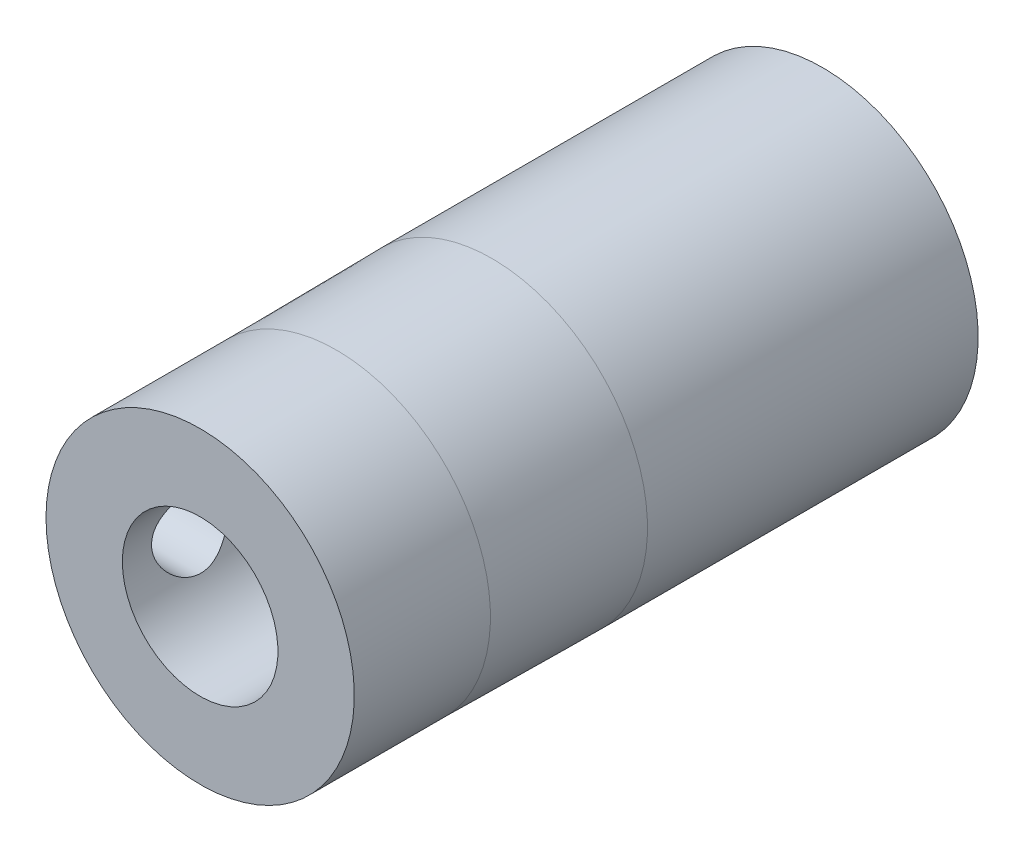
ISO-10303-21;
HEADER;
FILE_DESCRIPTION(('STEP AP214'),'2;1');
FILE_NAME('part.step','',(''),(''),'','','');
FILE_SCHEMA(('AUTOMOTIVE_DESIGN { 1 0 10303 214 1 1 1 1 }'));
ENDSEC;
DATA;
#1=APPLICATION_CONTEXT('core data for automotive mechanical design processes');
#2=APPLICATION_PROTOCOL_DEFINITION('international standard','automotive_design',2000,#1);
#3=PRODUCT_CONTEXT('',#1,'mechanical');
#4=PRODUCT('Part','Part','',(#3));
#5=PRODUCT_RELATED_PRODUCT_CATEGORY('part','',(#4));
#6=PRODUCT_DEFINITION_FORMATION('','',#4);
#7=PRODUCT_DEFINITION_CONTEXT('part definition',#1,'design');
#8=PRODUCT_DEFINITION('design','',#6,#7);
#9=PRODUCT_DEFINITION_SHAPE('','',#8);
#10=(LENGTH_UNIT() NAMED_UNIT(*) SI_UNIT(.MILLI.,.METRE.));
#11=(NAMED_UNIT(*) PLANE_ANGLE_UNIT() SI_UNIT($,.RADIAN.));
#12=(NAMED_UNIT(*) SI_UNIT($,.STERADIAN.) SOLID_ANGLE_UNIT());
#13=UNCERTAINTY_MEASURE_WITH_UNIT(LENGTH_MEASURE(1.E-05),#10,'distance_accuracy_value','');
#14=(GEOMETRIC_REPRESENTATION_CONTEXT(3) GLOBAL_UNCERTAINTY_ASSIGNED_CONTEXT((#13)) GLOBAL_UNIT_ASSIGNED_CONTEXT((#10,
#11,#12)) REPRESENTATION_CONTEXT('',''));
#15=CARTESIAN_POINT('',(0.,0.,0.));
#16=DIRECTION('',(0.,0.,1.));
#17=DIRECTION('',(1.,0.,0.));
#18=AXIS2_PLACEMENT_3D('',#15,#16,#17);
#19=CARTESIAN_POINT('',(0.,0.,-88.99));
#20=DIRECTION('',(0.,0.,-1.));
#21=DIRECTION('',(-1.,0.,0.));
#22=AXIS2_PLACEMENT_3D('',#19,#20,#21);
#23=CYLINDRICAL_SURFACE('',#22,4.);
#24=CARTESIAN_POINT('',(-4.,0.,-16.1741846858648));
#25=CARTESIAN_POINT('',(-3.99999426810082,0.105143925902467,-16.1741912904992));
#26=CARTESIAN_POINT('',(-3.99580982039513,0.210413199395125,-16.1825248321069));
#27=CARTESIAN_POINT('',(-3.97948312074314,0.417840470537793,-16.2154904465479));
#28=CARTESIAN_POINT('',(-3.96732575657839,0.519992173427259,-16.2401534718604));
#29=CARTESIAN_POINT('',(-3.93632558806751,0.717867089760898,-16.304572303098));
#30=CARTESIAN_POINT('',(-3.91750878355075,0.813613605878293,-16.3442694543607));
#31=CARTESIAN_POINT('',(-3.87491553031523,0.996945233613198,-16.4373259285947));
#32=CARTESIAN_POINT('',(-3.8511394726705,1.08453098798012,-16.4906841743625));
#33=CARTESIAN_POINT('',(-3.79912516516124,1.25501563552382,-16.6132191848353));
#34=CARTESIAN_POINT('',(-3.77070398255074,1.33731042224422,-16.683157644344));
#35=CARTESIAN_POINT('',(-3.71319940493486,1.48955888973396,-16.8352276443588));
#36=CARTESIAN_POINT('',(-3.68411552418069,1.55950316621354,-16.9173683894097));
#37=CARTESIAN_POINT('',(-3.62597902394695,1.69050400090056,-17.0991513849115));
#38=CARTESIAN_POINT('',(-3.59710373940264,1.75045067110328,-17.1996568825566));
#39=CARTESIAN_POINT('',(-3.54571957544641,1.85233645378139,-17.4109193578372));
#40=CARTESIAN_POINT('',(-3.52320615213979,1.89428842993267,-17.5216689433103));
#41=CARTESIAN_POINT('',(-3.48915734075617,1.95626488437718,-17.7435148967086));
#42=CARTESIAN_POINT('',(-3.47704543167427,1.97745171416089,-17.8541935899996));
#43=CARTESIAN_POINT('',(-3.46363779897055,2.00085398661769,-18.0781423614237));
#44=CARTESIAN_POINT('',(-3.46233138686576,2.00308817674615,-18.1914097676071));
#45=CARTESIAN_POINT('',(-3.47021860514497,1.98937457434459,-18.4027567344955));
#46=CARTESIAN_POINT('',(-3.47817527324027,1.97556911907365,-18.5010327483109));
#47=CARTESIAN_POINT('',(-3.501524574677,1.93387969811387,-18.6936285046109));
#48=CARTESIAN_POINT('',(-3.51691957663552,1.90599124779531,-18.7879469764754));
#49=CARTESIAN_POINT('',(-3.55374952825482,1.83641956077201,-18.9726429509961));
#50=CARTESIAN_POINT('',(-3.57531681327997,1.79443013423199,-19.0628774834364));
#51=CARTESIAN_POINT('',(-3.62206808562807,1.69808337533601,-19.2354532710448));
#52=CARTESIAN_POINT('',(-3.64725369560381,1.64372048762494,-19.317790957065));
#53=CARTESIAN_POINT('',(-3.70226315806571,1.51613210982558,-19.4832271913512));
#54=CARTESIAN_POINT('',(-3.73227020473492,1.44138891673857,-19.5650984330171));
#55=CARTESIAN_POINT('',(-3.79095246600814,1.27911115748275,-19.7156555230466));
#56=CARTESIAN_POINT('',(-3.81962703917602,1.19157051314857,-19.7843350699325));
#57=CARTESIAN_POINT('',(-3.87403974565928,1.0010330116637,-19.9095560079242));
#58=CARTESIAN_POINT('',(-3.89957968324014,0.897507183198821,-19.9653856307563));
#59=CARTESIAN_POINT('',(-3.94315762242485,0.680932430977596,-20.0583787439508));
#60=CARTESIAN_POINT('',(-3.96120157887106,0.567891152530555,-20.0955570558951));
#61=CARTESIAN_POINT('',(-3.98648667482871,0.345532983321407,-20.1471354932981));
#62=CARTESIAN_POINT('',(-3.9944987660262,0.236683061096655,-20.1631671573583));
#63=CARTESIAN_POINT('',(-4.00146026918207,0.0175591998987055,-20.1771141481338));
#64=CARTESIAN_POINT('',(-4.00041397442637,-0.0927140397398156,-20.1750380571437));
#65=CARTESIAN_POINT('',(-3.9898238450687,-0.302465943971972,-20.1537713090273));
#66=CARTESIAN_POINT('',(-3.98094491376337,-0.402118816099858,-20.1359196204048));
#67=CARTESIAN_POINT('',(-3.95644342629681,-0.596813784603881,-20.0857085420745));
#68=CARTESIAN_POINT('',(-3.94082012668824,-0.691855371382173,-20.0533475529578));
#69=CARTESIAN_POINT('',(-3.90368502827176,-0.877777216899145,-19.9741877529987));
#70=CARTESIAN_POINT('',(-3.88201763539262,-0.968460794011606,-19.9270025856322));
#71=CARTESIAN_POINT('',(-3.83487948634835,-1.14092272339854,-19.8199696145716));
#72=CARTESIAN_POINT('',(-3.80940711133877,-1.22269725955318,-19.760116416674));
#73=CARTESIAN_POINT('',(-3.75416442672396,-1.38353537857843,-19.6226638352033));
#74=CARTESIAN_POINT('',(-3.72421769686998,-1.46154415563805,-19.5438989489745));
#75=CARTESIAN_POINT('',(-3.6652478321764,-1.60371264223771,-19.3743343833093));
#76=CARTESIAN_POINT('',(-3.63622534800094,-1.66786277142375,-19.2835264481689));
#77=CARTESIAN_POINT('',(-3.58102384412979,-1.78341582895804,-19.0868973775188));
#78=CARTESIAN_POINT('',(-3.55505059178121,-1.8340509916005,-18.9805621536758));
#79=CARTESIAN_POINT('',(-3.51148144588269,-1.91616565186941,-18.7591645507148));
#80=CARTESIAN_POINT('',(-3.493874764435,-1.94766983173404,-18.644113632931));
#81=CARTESIAN_POINT('',(-3.47123002051604,-1.98772337493375,-18.4203642400954));
#82=CARTESIAN_POINT('',(-3.4651476693013,-1.99818599281091,-18.3121161789943));
#83=CARTESIAN_POINT('',(-3.46330709283206,-2.00137830875241,-18.0952905515357));
#84=CARTESIAN_POINT('',(-3.4675443925278,-1.99411569324649,-17.9867131483891));
#85=CARTESIAN_POINT('',(-3.48475724102153,-1.96385225118662,-17.7832176827979));
#86=CARTESIAN_POINT('',(-3.49686188965317,-1.94241662868607,-17.6879837455753));
#87=CARTESIAN_POINT('',(-3.52742032375305,-1.88635071644882,-17.502568447016));
#88=CARTESIAN_POINT('',(-3.54587615139337,-1.85171618231985,-17.4123887216807));
#89=CARTESIAN_POINT('',(-3.58857060729071,-1.76763149060113,-17.2329349838917));
#90=CARTESIAN_POINT('',(-3.61311444791841,-1.7173422756314,-17.1441288822067));
#91=CARTESIAN_POINT('',(-3.66470663269721,-1.60430194327479,-16.9756356135023));
#92=CARTESIAN_POINT('',(-3.69175627591221,-1.54154434248313,-16.8959532248226));
#93=CARTESIAN_POINT('',(-3.74924646316184,-1.39640665332275,-16.7379007211554));
#94=CARTESIAN_POINT('',(-3.77969966613256,-1.31256884599452,-16.6608664811642));
#95=CARTESIAN_POINT('',(-3.83755504519861,-1.1323096124664,-16.5216587189942));
#96=CARTESIAN_POINT('',(-3.8649555725239,-1.0358814466104,-16.459493206925));
#97=CARTESIAN_POINT('',(-3.91396019133075,-0.831863193565893,-16.3517119604406));
#98=CARTESIAN_POINT('',(-3.93552192987866,-0.724199007553462,-16.3062163473918));
#99=CARTESIAN_POINT('',(-3.97002682597974,-0.501484202276174,-16.23456835035));
#100=CARTESIAN_POINT('',(-3.98299446726136,-0.386455599178201,-16.2083609922533));
#101=CARTESIAN_POINT('',(-3.99390923826956,-0.225203892981792,-16.1863898636933));
#102=CARTESIAN_POINT('',(-3.99618730680502,-0.18032375888313,-16.1818194041321));
#103=CARTESIAN_POINT('',(-3.99923393953631,-0.0903034636101833,-16.1757153548366));
#104=CARTESIAN_POINT('',(-4.00000246206762,-0.0451632952932569,-16.1741818489244));
#105=CARTESIAN_POINT('',(-4.,0.,-16.1741846858648));
#106=B_SPLINE_CURVE_WITH_KNOTS('',3,(#24,#25,#26,#27,#28,#29,#30,#31,#32,#33,#34,#35,#36,#37,
#38,#39,#40,#41,#42,#43,#44,#45,#46,#47,#48,#49,#50,#51,#52,#53,#54,#55,#56,#57,#58,#59,#60,#61,
#62,#63,#64,#65,#66,#67,#68,#69,#70,#71,#72,#73,#74,#75,#76,#77,#78,#79,#80,#81,#82,#83,#84,#85,
#86,#87,#88,#89,#90,#91,#92,#93,#94,#95,#96,#97,#98,#99,#100,#101,#102,#103,#104,#105),
.UNSPECIFIED.,.T.,.F.,(4,2,2,2,2,2,2,2,2,2,2,2,2,2,2,2,2,2,2,2,2,2,2,2,2,2,2,2,2,2,2,2,2,2,2,2,
2,2,2,2,4),(0.,0.315248514840585,0.631096299418395,0.945724310984597,1.26032752116314,
1.59396351743618,1.92785247530807,2.28763452861506,2.64715895796562,2.9851602428046,
3.32282714658041,3.62011424818642,3.91749607851358,4.22180480336975,4.52625042520444,
4.86929882667758,5.21251069197373,5.57166044428882,5.9305243382456,6.25966580942692,
6.58865129022953,6.89213813012245,7.19565843261864,7.50785712055798,7.8201890149668,
8.16319221288839,8.50643177230864,8.86629364323453,9.22569023890903,9.55058615006095,
9.87534119729358,10.1691586049771,10.463070575767,10.7767291356058,11.0905512228726,
11.4425048551434,11.7946476676249,12.1492802732706,12.502898172423,12.6383056026784,
12.7737167702213),.UNSPECIFIED.);
#107=CARTESIAN_POINT('',(-4.,0.,-16.1741846858648));
#108=VERTEX_POINT('',#107);
#109=EDGE_CURVE('E74',#108,#108,#106,.T.);
#110=ORIENTED_EDGE('',*,*,#109,.T.);
#111=EDGE_LOOP('',(#110));
#112=FACE_BOUND('',#111,.T.);
#113=CARTESIAN_POINT('',(0.,0.,-14.6741846858648));
#114=DIRECTION('',(0.,0.,-1.));
#115=DIRECTION('',(-1.,0.,0.));
#116=AXIS2_PLACEMENT_3D('',#113,#114,#115);
#117=CIRCLE('',#116,4.);
#118=CARTESIAN_POINT('',(-4.,0.,-14.6741846858648));
#119=VERTEX_POINT('',#118);
#120=EDGE_CURVE('E70',#119,#119,#117,.T.);
#121=ORIENTED_EDGE('',*,*,#120,.F.);
#122=EDGE_LOOP('',(#121));
#123=FACE_BOUND('',#122,.T.);
#124=CARTESIAN_POINT('',(0.,0.,-46.6741846858648));
#125=DIRECTION('',(0.,0.,-1.));
#126=DIRECTION('',(-1.,0.,0.));
#127=AXIS2_PLACEMENT_3D('',#124,#125,#126);
#128=CIRCLE('',#127,4.);
#129=CARTESIAN_POINT('',(-4.,0.,-46.6741846858648));
#130=VERTEX_POINT('',#129);
#131=EDGE_CURVE('E10',#130,#130,#128,.T.);
#132=ORIENTED_EDGE('',*,*,#131,.T.);
#133=EDGE_LOOP('',(#132));
#134=FACE_BOUND('',#133,.T.);
#135=ADVANCED_FACE('F37',(#112,#123,#134),#23,.F.);
#136=CARTESIAN_POINT('',(4.,0.,-46.6741846858648));
#137=DIRECTION('',(0.,0.,1.));
#138=DIRECTION('',(1.,0.,0.));
#139=AXIS2_PLACEMENT_3D('',#136,#137,#138);
#140=PLANE('',#139);
#141=ORIENTED_EDGE('',*,*,#131,.F.);
#142=EDGE_LOOP('',(#141));
#143=FACE_BOUND('',#142,.T.);
#144=CARTESIAN_POINT('',(0.,0.,-46.6741846858648));
#145=DIRECTION('',(0.,0.,-1.));
#146=DIRECTION('',(-1.,0.,0.));
#147=AXIS2_PLACEMENT_3D('',#144,#145,#146);
#148=CIRCLE('',#147,8.);
#149=CARTESIAN_POINT('',(-8.,0.,-46.6741846858648));
#150=VERTEX_POINT('',#149);
#151=EDGE_CURVE('E51',#150,#150,#148,.T.);
#152=ORIENTED_EDGE('',*,*,#151,.T.);
#153=EDGE_LOOP('',(#152));
#154=FACE_BOUND('',#153,.T.);
#155=ADVANCED_FACE('F100',(#143,#154),#140,.F.);
#156=CARTESIAN_POINT('',(0.,0.,-88.99));
#157=DIRECTION('',(0.,0.,-1.));
#158=DIRECTION('',(-1.,0.,0.));
#159=AXIS2_PLACEMENT_3D('',#156,#157,#158);
#160=CYLINDRICAL_SURFACE('',#159,8.);
#161=ORIENTED_EDGE('',*,*,#151,.F.);
#162=EDGE_LOOP('',(#161));
#163=FACE_BOUND('',#162,.T.);
#164=CARTESIAN_POINT('',(0.,0.,-29.6741846858648));
#165=DIRECTION('',(0.,0.,-1.));
#166=DIRECTION('',(-1.,0.,0.));
#167=AXIS2_PLACEMENT_3D('',#164,#165,#166);
#168=CIRCLE('',#167,8.);
#169=CARTESIAN_POINT('',(-8.,0.,-29.6741846858648));
#170=VERTEX_POINT('',#169);
#171=EDGE_CURVE('E56',#170,#170,#168,.T.);
#172=ORIENTED_EDGE('',*,*,#171,.T.);
#173=EDGE_LOOP('',(#172));
#174=FACE_BOUND('',#173,.T.);
#175=ADVANCED_FACE('F97',(#163,#174),#160,.T.);
#176=CARTESIAN_POINT('',(0.,0.,-21.6741846858648));
#177=DIRECTION('',(0.,0.,-1.));
#178=DIRECTION('',(-1.,0.,0.));
#179=AXIS2_PLACEMENT_3D('',#176,#177,#178);
#180=CONICAL_SURFACE('',#179,7.925,0.00937472535628038);
#181=ORIENTED_EDGE('',*,*,#171,.F.);
#182=EDGE_LOOP('',(#181));
#183=FACE_BOUND('',#182,.T.);
#184=CARTESIAN_POINT('',(0.,0.,-21.6741846858648));
#185=DIRECTION('',(0.,0.,-1.));
#186=DIRECTION('',(-1.,0.,0.));
#187=AXIS2_PLACEMENT_3D('',#184,#185,#186);
#188=CIRCLE('',#187,7.925);
#189=CARTESIAN_POINT('',(-7.925,0.,-21.6741846858648));
#190=VERTEX_POINT('',#189);
#191=EDGE_CURVE('E62',#190,#190,#188,.T.);
#192=ORIENTED_EDGE('',*,*,#191,.T.);
#193=EDGE_LOOP('',(#192));
#194=FACE_BOUND('',#193,.T.);
#195=ADVANCED_FACE('F93',(#183,#194),#180,.T.);
#196=CARTESIAN_POINT('',(0.,0.,-88.99));
#197=DIRECTION('',(0.,0.,-1.));
#198=DIRECTION('',(-1.,0.,0.));
#199=AXIS2_PLACEMENT_3D('',#196,#197,#198);
#200=CYLINDRICAL_SURFACE('',#199,7.925);
#201=CARTESIAN_POINT('',(-7.925,0.,-16.1741846858648));
#202=CARTESIAN_POINT('',(-7.92499815560463,-0.110467283690188,-16.1741877236811));
#203=CARTESIAN_POINT('',(-7.92266730715876,-0.220968300361136,-16.1833677259406));
#204=CARTESIAN_POINT('',(-7.91359501514183,-0.438801117539455,-16.2197888088893));
#205=CARTESIAN_POINT('',(-7.90685112414002,-0.546131124894325,-16.2470399117485));
#206=CARTESIAN_POINT('',(-7.88969919084804,-0.75444495755488,-16.318671416793));
#207=CARTESIAN_POINT('',(-7.87929559525493,-0.855436309891213,-16.363031037676));
#208=CARTESIAN_POINT('',(-7.85593105956936,-1.0485442895145,-16.4675467146624));
#209=CARTESIAN_POINT('',(-7.84297002136067,-1.14066057610789,-16.5277033768483));
#210=CARTESIAN_POINT('',(-7.81559292593024,-1.31533403079349,-16.6634370328976));
#211=CARTESIAN_POINT('',(-7.80115407950671,-1.39767871726148,-16.7392828820174));
#212=CARTESIAN_POINT('',(-7.77259940821994,-1.5486244425662,-16.9036664315994));
#213=CARTESIAN_POINT('',(-7.75848362067466,-1.61722390065766,-16.9922055898264));
#214=CARTESIAN_POINT('',(-7.73194309127227,-1.73973626810463,-17.1811186805497));
#215=CARTESIAN_POINT('',(-7.7195472562737,-1.79341055430188,-17.2816517937919));
#216=CARTESIAN_POINT('',(-7.69818286043937,-1.88301407627076,-17.4906776236542));
#217=CARTESIAN_POINT('',(-7.68921374024995,-1.91894620843132,-17.5991690377659));
#218=CARTESIAN_POINT('',(-7.67595265903681,-1.9713187612319,-17.8186930053234));
#219=CARTESIAN_POINT('',(-7.67156906058938,-1.98814167515907,-17.9296286408931));
#220=CARTESIAN_POINT('',(-7.66770112520043,-2.0030098085275,-18.1528275200427));
#221=CARTESIAN_POINT('',(-7.6682159750434,-2.00105814482823,-18.2650905401664));
#222=CARTESIAN_POINT('',(-7.67400443888595,-1.97873748838844,-18.4848185542977));
#223=CARTESIAN_POINT('',(-7.67916002882272,-1.95882524635753,-18.5923335425315));
#224=CARTESIAN_POINT('',(-7.69346085542971,-1.90187769127625,-18.802445322528));
#225=CARTESIAN_POINT('',(-7.70260638113283,-1.86484113772072,-18.9050417573906));
#226=CARTESIAN_POINT('',(-7.72396430642701,-1.77430942398344,-19.1036241150823));
#227=CARTESIAN_POINT('',(-7.73620721242447,-1.72064928084673,-19.199531404872));
#228=CARTESIAN_POINT('',(-7.76236332355084,-1.5985089470189,-19.3811436493251));
#229=CARTESIAN_POINT('',(-7.77627682586921,-1.53002611771287,-19.4668467833113));
#230=CARTESIAN_POINT('',(-7.80470258656266,-1.37782269219597,-19.6282343075721));
#231=CARTESIAN_POINT('',(-7.81922049122474,-1.29371691345138,-19.7035549041866));
#232=CARTESIAN_POINT('',(-7.84685470309576,-1.11389352166157,-19.8390924755977));
#233=CARTESIAN_POINT('',(-7.85997096586611,-1.01817554066071,-19.8993089716053));
#234=CARTESIAN_POINT('',(-7.88339136507586,-0.817319637884425,-20.0030662507812));
#235=CARTESIAN_POINT('',(-7.89368534205397,-0.712149448167654,-20.0465470108559));
#236=CARTESIAN_POINT('',(-7.91022750221215,-0.495674553756097,-20.1151098117081));
#237=CARTESIAN_POINT('',(-7.91647647442644,-0.38437105004847,-20.1401954408376));
#238=CARTESIAN_POINT('',(-7.92410741688072,-0.161898612652763,-20.1706981456753));
#239=CARTESIAN_POINT('',(-7.92561192149907,-0.0508016912122032,-20.1766105217589));
#240=CARTESIAN_POINT('',(-7.92393386794909,0.170794477282198,-20.1699586613478));
#241=CARTESIAN_POINT('',(-7.92075174026358,0.281293778293792,-20.1573961218358));
#242=CARTESIAN_POINT('',(-7.91013658200322,0.496830440482002,-20.1145590324505));
#243=CARTESIAN_POINT('',(-7.90276864106009,0.601925167579485,-20.0845555284699));
#244=CARTESIAN_POINT('',(-7.88461299135785,0.805583694268079,-20.0079985081132));
#245=CARTESIAN_POINT('',(-7.87382493349218,0.904146825907923,-19.9614433021725));
#246=CARTESIAN_POINT('',(-7.84973311954012,1.09390857992741,-19.8521502241626));
#247=CARTESIAN_POINT('',(-7.83638756001309,1.1849426235564,-19.7891360374941));
#248=CARTESIAN_POINT('',(-7.80872562635968,1.35531984164883,-19.6490661143885));
#249=CARTESIAN_POINT('',(-7.79440908161178,1.43466095361767,-19.5720079061011));
#250=CARTESIAN_POINT('',(-7.76597629225389,1.58144763251069,-19.4037359124455));
#251=CARTESIAN_POINT('',(-7.75187404696498,1.64854546154385,-19.3122159050158));
#252=CARTESIAN_POINT('',(-7.72586584789892,1.76643151537638,-19.1189237966638));
#253=CARTESIAN_POINT('',(-7.71395979711373,1.81722046062833,-19.0171521488734));
#254=CARTESIAN_POINT('',(-7.69382419812146,1.90066768641622,-18.8067876976487));
#255=CARTESIAN_POINT('',(-7.68557294493583,1.93343329234509,-18.6982396547285));
#256=CARTESIAN_POINT('',(-7.67366228601241,1.98018308785555,-18.4769349125925));
#257=CARTESIAN_POINT('',(-7.67000185318686,1.99417147844543,-18.3641791605674));
#258=CARTESIAN_POINT('',(-7.66776662335371,2.00274712948632,-18.1412012147148));
#259=CARTESIAN_POINT('',(-7.66904602245276,1.99789059463416,-18.031001534822));
#260=CARTESIAN_POINT('',(-7.67620860479799,1.9701896046946,-17.8130469750231));
#261=CARTESIAN_POINT('',(-7.68209169209302,1.94734552450781,-17.7052920442111));
#262=CARTESIAN_POINT('',(-7.69771673177831,1.88462433778536,-17.4959036751212));
#263=CARTESIAN_POINT('',(-7.7074345979832,1.84485342820337,-17.3942365047381));
#264=CARTESIAN_POINT('',(-7.72963721336929,1.74949128252911,-17.1989445290598));
#265=CARTESIAN_POINT('',(-7.74212235344629,1.69389781107944,-17.105320862558));
#266=CARTESIAN_POINT('',(-7.76886695608119,1.56673294355218,-16.926090297665));
#267=CARTESIAN_POINT('',(-7.78316472886576,1.49477648907117,-16.8407622724121));
#268=CARTESIAN_POINT('',(-7.81169699595814,1.33767611917738,-16.6832111952248));
#269=CARTESIAN_POINT('',(-7.82593147438589,1.2525290673691,-16.6109912689621));
#270=CARTESIAN_POINT('',(-7.85304853986751,1.06955797029749,-16.4803985151982));
#271=CARTESIAN_POINT('',(-7.8659011471158,0.971528045357169,-16.4223074384866));
#272=CARTESIAN_POINT('',(-7.88848851684748,0.766777558646331,-16.3235220445562));
#273=CARTESIAN_POINT('',(-7.89822548038651,0.660063199168104,-16.2828154391927));
#274=CARTESIAN_POINT('',(-7.91206973267312,0.461305630072431,-16.2258963072593));
#275=CARTESIAN_POINT('',(-7.91688499952569,0.370197326914542,-16.2065467888449));
#276=CARTESIAN_POINT('',(-7.92335078619402,0.186067226351787,-16.1806902009749));
#277=CARTESIAN_POINT('',(-7.92500155351729,0.0930455791720697,-16.17418212714));
#278=CARTESIAN_POINT('',(-7.925,0.,-16.1741846858648));
#279=B_SPLINE_CURVE_WITH_KNOTS('',3,(#201,#202,#203,#204,#205,#206,#207,#208,#209,#210,#211,
#212,#213,#214,#215,#216,#217,#218,#219,#220,#221,#222,#223,#224,#225,#226,#227,#228,#229,#230,
#231,#232,#233,#234,#235,#236,#237,#238,#239,#240,#241,#242,#243,#244,#245,#246,#247,#248,#249,
#250,#251,#252,#253,#254,#255,#256,#257,#258,#259,#260,#261,#262,#263,#264,#265,#266,#267,#268,
#269,#270,#271,#272,#273,#274,#275,#276,#277,#278),.UNSPECIFIED.,.T.,.F.,(4,2,2,2,2,2,2,2,2,2,2,
2,2,2,2,2,2,2,2,2,2,2,2,2,2,2,2,2,2,2,2,2,2,2,2,2,2,2,4),(0.,0.331060839673029,0.66230543827143,
0.993148942880112,1.32400514276122,1.66108684032801,1.99820728114758,2.34044267333162,
2.68262217744262,3.01782471457154,3.35297160404795,3.67982856265021,4.00670920286358,
4.33694397993293,4.66723759114963,5.00713556920819,5.34704432042219,5.68816104812738,
6.02921121622109,6.36137781257069,6.69351390021224,7.02062132861005,7.34776215707336,
7.68079401230908,8.0138845402911,8.35531830895204,8.69673699254082,9.03609995752115,
9.37538698449097,9.70473727509172,10.0340807014787,10.3613876370403,10.6887408363785,
11.0247860794596,11.3609113487189,11.7032724749305,12.0453912023869,12.3242625216075,
12.6031120283534),.UNSPECIFIED.);
#280=CARTESIAN_POINT('',(-7.925,0.,-16.1741846858648));
#281=VERTEX_POINT('',#280);
#282=EDGE_CURVE('E41',#281,#281,#279,.T.);
#283=ORIENTED_EDGE('',*,*,#282,.T.);
#284=EDGE_LOOP('',(#283));
#285=FACE_BOUND('',#284,.T.);
#286=ORIENTED_EDGE('',*,*,#191,.F.);
#287=EDGE_LOOP('',(#286));
#288=FACE_BOUND('',#287,.T.);
#289=CARTESIAN_POINT('',(0.,0.,-14.6741846858648));
#290=DIRECTION('',(0.,0.,-1.));
#291=DIRECTION('',(-1.,0.,0.));
#292=AXIS2_PLACEMENT_3D('',#289,#290,#291);
#293=CIRCLE('',#292,7.925);
#294=CARTESIAN_POINT('',(-7.925,0.,-14.6741846858648));
#295=VERTEX_POINT('',#294);
#296=EDGE_CURVE('E66',#295,#295,#293,.T.);
#297=ORIENTED_EDGE('',*,*,#296,.T.);
#298=EDGE_LOOP('',(#297));
#299=FACE_BOUND('',#298,.T.);
#300=ADVANCED_FACE('F88',(#285,#288,#299),#200,.T.);
#301=CARTESIAN_POINT('',(7.925,0.,-14.6741846858648));
#302=DIRECTION('',(0.,0.,-1.));
#303=DIRECTION('',(-1.,0.,0.));
#304=AXIS2_PLACEMENT_3D('',#301,#302,#303);
#305=PLANE('',#304);
#306=ORIENTED_EDGE('',*,*,#296,.F.);
#307=EDGE_LOOP('',(#306));
#308=FACE_BOUND('',#307,.T.);
#309=ORIENTED_EDGE('',*,*,#120,.T.);
#310=EDGE_LOOP('',(#309));
#311=FACE_BOUND('',#310,.T.);
#312=ADVANCED_FACE('F84',(#308,#311),#305,.F.);
#313=CARTESIAN_POINT('',(-8.,0.,-18.1741846858648));
#314=DIRECTION('',(1.,0.,0.));
#315=DIRECTION('',(0.,0.,-1.));
#316=AXIS2_PLACEMENT_3D('',#313,#314,#315);
#317=CYLINDRICAL_SURFACE('',#316,2.);
#318=ORIENTED_EDGE('',*,*,#282,.F.);
#319=EDGE_LOOP('',(#318));
#320=FACE_BOUND('',#319,.T.);
#321=ORIENTED_EDGE('',*,*,#109,.F.);
#322=EDGE_LOOP('',(#321));
#323=FACE_BOUND('',#322,.T.);
#324=ADVANCED_FACE('F80',(#320,#323),#317,.F.);
#325=CLOSED_SHELL('',(#135,#155,#175,#195,#300,#312,#324));
#326=MANIFOLD_SOLID_BREP('B2',#325);
#327=ADVANCED_BREP_SHAPE_REPRESENTATION('',(#18,#326),#14);
#328=SHAPE_DEFINITION_REPRESENTATION(#9,#327);
ENDSEC;
END-ISO-10303-21;
